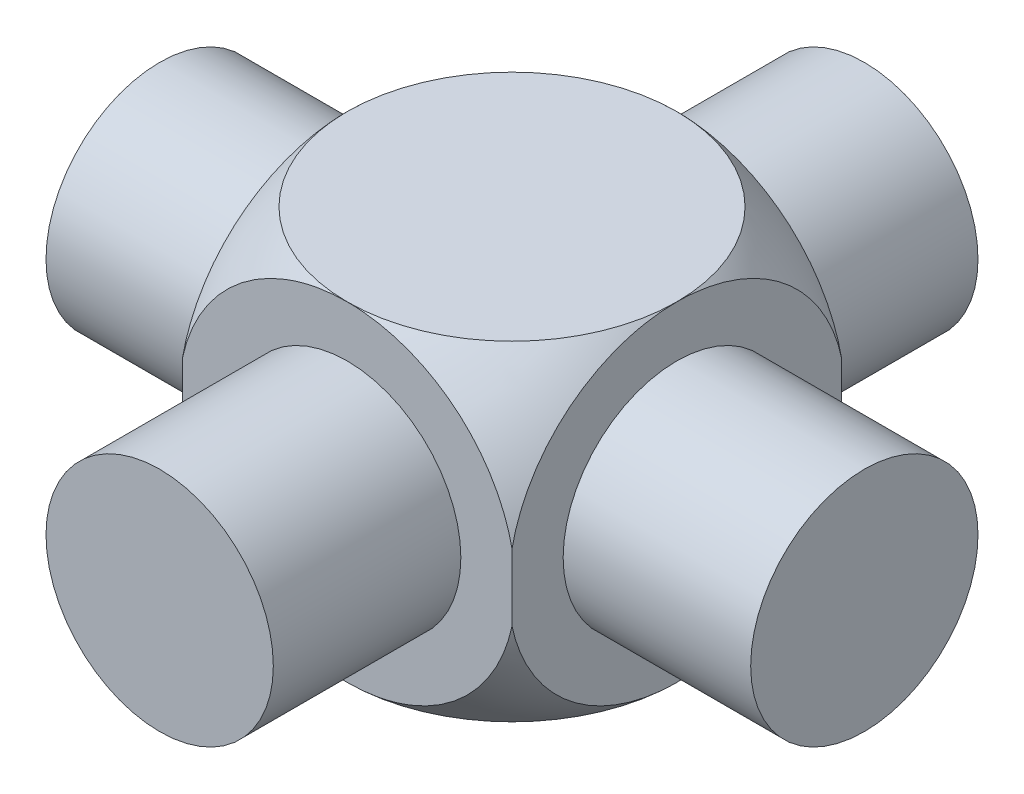
ISO-10303-21;
HEADER;
FILE_DESCRIPTION(('STEP AP214'),'2;1');
FILE_NAME('part.step','',(''),(''),'','','');
FILE_SCHEMA(('AUTOMOTIVE_DESIGN { 1 0 10303 214 1 1 1 1 }'));
ENDSEC;
DATA;
#1=APPLICATION_CONTEXT('core data for automotive mechanical design processes');
#2=APPLICATION_PROTOCOL_DEFINITION('international standard','automotive_design',2000,#1);
#3=PRODUCT_CONTEXT('',#1,'mechanical');
#4=PRODUCT('Part','Part','',(#3));
#5=PRODUCT_RELATED_PRODUCT_CATEGORY('part','',(#4));
#6=PRODUCT_DEFINITION_FORMATION('','',#4);
#7=PRODUCT_DEFINITION_CONTEXT('part definition',#1,'design');
#8=PRODUCT_DEFINITION('design','',#6,#7);
#9=PRODUCT_DEFINITION_SHAPE('','',#8);
#10=(LENGTH_UNIT() NAMED_UNIT(*) SI_UNIT(.MILLI.,.METRE.));
#11=(NAMED_UNIT(*) PLANE_ANGLE_UNIT() SI_UNIT($,.RADIAN.));
#12=(NAMED_UNIT(*) SI_UNIT($,.STERADIAN.) SOLID_ANGLE_UNIT());
#13=UNCERTAINTY_MEASURE_WITH_UNIT(LENGTH_MEASURE(1.E-05),#10,'distance_accuracy_value','');
#14=(GEOMETRIC_REPRESENTATION_CONTEXT(3) GLOBAL_UNCERTAINTY_ASSIGNED_CONTEXT((#13)) GLOBAL_UNIT_ASSIGNED_CONTEXT((#10,
#11,#12)) REPRESENTATION_CONTEXT('',''));
#15=CARTESIAN_POINT('',(0.,0.,0.));
#16=DIRECTION('',(0.,0.,1.));
#17=DIRECTION('',(1.,0.,0.));
#18=AXIS2_PLACEMENT_3D('',#15,#16,#17);
#19=CARTESIAN_POINT('',(0.,0.,0.));
#20=DIRECTION('',(0.,0.,-1.));
#21=DIRECTION('',(-1.,0.,0.));
#22=AXIS2_PLACEMENT_3D('',#19,#20,#21);
#23=PLANE('',#22);
#24=CARTESIAN_POINT('',(0.,0.,0.));
#25=DIRECTION('',(0.,0.,-1.));
#26=DIRECTION('',(-1.,0.,0.));
#27=AXIS2_PLACEMENT_3D('',#24,#25,#26);
#28=CIRCLE('',#27,5.);
#29=CARTESIAN_POINT('',(-5.,0.,0.));
#30=VERTEX_POINT('',#29);
#31=EDGE_CURVE('E271',#30,#30,#28,.F.);
#32=ORIENTED_EDGE('',*,*,#31,.T.);
#33=EDGE_LOOP('',(#32));
#34=FACE_BOUND('',#33,.T.);
#35=DIRECTION('',(0.,1.,0.));
#36=VECTOR('',#35,1.);
#37=CARTESIAN_POINT('',(7.25,-7.25,0.));
#38=LINE('',#37,#36);
#39=CARTESIAN_POINT('',(7.24999999999937,-1.47556028833769,0.));
#40=VERTEX_POINT('',#39);
#41=CARTESIAN_POINT('',(7.2500000000003,1.47556028833331,0.));
#42=VERTEX_POINT('',#41);
#43=EDGE_CURVE('E192',#40,#42,#38,.T.);
#44=ORIENTED_EDGE('',*,*,#43,.F.);
#45=CARTESIAN_POINT('',(0.,7.25000000076297,-1.77719099726946E-09));
#46=CARTESIAN_POINT('',(0.35472004270874,7.24999758244147,-1.8330662880225E-09));
#47=CARTESIAN_POINT('',(0.709474508952601,7.22523308015603,-4.94346678581421E-10));
#48=CARTESIAN_POINT('',(1.41224711914956,7.12649843602525,4.94667282722035E-10));
#49=CARTESIAN_POINT('',(1.76026074510913,7.05249639271668,1.43866058347404E-10));
#50=CARTESIAN_POINT('',(2.51233008689046,6.83612193131198,-1.73252608140504E-10));
#51=CARTESIAN_POINT('',(2.91331280350856,6.68287158037924,-4.63974928758699E-11));
#52=CARTESIAN_POINT('',(3.68315950732936,6.30982066746921,4.64110559939562E-11));
#53=CARTESIAN_POINT('',(4.05201407117917,6.09000066433889,1.23174432754697E-11));
#54=CARTESIAN_POINT('',(4.73896399465613,5.59465483068441,-1.20692013764072E-11));
#55=CARTESIAN_POINT('',(5.05793252134144,5.32034096251592,-3.23112867431066E-12));
#56=CARTESIAN_POINT('',(5.64389438891725,4.72094491768709,3.23048269411637E-12));
#57=CARTESIAN_POINT('',(5.91089810814616,4.39587290179467,8.562630617821E-13));
#58=CARTESIAN_POINT('',(6.37909598008788,3.71230531610222,-8.36657729446776E-13));
#59=CARTESIAN_POINT('',(6.58165695898144,3.35474544226318,-2.24074556656652E-13));
#60=CARTESIAN_POINT('',(6.92294318845848,2.61035305836525,2.24059101391433E-13));
#61=CARTESIAN_POINT('',(7.06167284106879,2.22352256905132,0.));
#62=CARTESIAN_POINT('',(7.26963430995826,1.43712161220858,0.));
#63=CARTESIAN_POINT('',(7.33976410707118,1.03778838306784,0.));
#64=CARTESIAN_POINT('',(7.41160906915009,0.233019121038544,0.));
#65=CARTESIAN_POINT('',(7.41332699506261,-0.172416664904157,0.));
#66=CARTESIAN_POINT('',(7.34846706762037,-0.975703822197179,0.));
#67=CARTESIAN_POINT('',(7.28223584873591,-1.37358324614371,0.));
#68=CARTESIAN_POINT('',(7.08398733439277,-2.15258969912997,0.));
#69=CARTESIAN_POINT('',(6.95197061862117,-2.53371687575455,0.));
#70=CARTESIAN_POINT('',(6.62588148450303,-3.26895967896404,0.));
#71=CARTESIAN_POINT('',(6.43173515974464,-3.62304251035949,0.));
#72=CARTESIAN_POINT('',(5.98718559477087,-4.29390583691687,0.));
#73=CARTESIAN_POINT('',(5.73678137269134,-4.61068568088594,0.));
#74=CARTESIAN_POINT('',(5.18488673761718,-5.20074887357059,0.));
#75=CARTESIAN_POINT('',(4.88301213721546,-5.47367270146353,0.));
#76=CARTESIAN_POINT('',(4.2383736787491,-5.96592873388828,0.));
#77=CARTESIAN_POINT('',(3.89560734515286,-6.18525769140469,0.));
#78=CARTESIAN_POINT('',(3.17295154351401,-6.56820396583086,0.));
#79=CARTESIAN_POINT('',(2.79254013382352,-6.73083566338456,0.));
#80=CARTESIAN_POINT('',(2.0102258224592,-6.99165660760054,0.));
#81=CARTESIAN_POINT('',(1.6083192129857,-7.08983469735805,0.));
#82=CARTESIAN_POINT('',(0.783923633691014,-7.22140216196393,0.));
#83=CARTESIAN_POINT('',(0.36117164060091,-7.25314529107947,0.));
#84=CARTESIAN_POINT('',(-0.483796894375683,-7.24636211173279,0.));
#85=CARTESIAN_POINT('',(-0.906013375771644,-7.20782846885773,0.));
#86=CARTESIAN_POINT('',(-1.74430302543486,-7.06011433150494,0.));
#87=CARTESIAN_POINT('',(-2.16019743431917,-6.94991412113624,0.));
#88=CARTESIAN_POINT('',(-2.96713587965513,-6.66023886281381,0.));
#89=CARTESIAN_POINT('',(-3.35818228140884,-6.48077042009926,0.));
#90=CARTESIAN_POINT('',(-4.09808265267317,-6.0600096399267,0.));
#91=CARTESIAN_POINT('',(-4.44746108450747,-5.81964040748842,0.));
#92=CARTESIAN_POINT('',(-5.09957014268305,-5.28227019095751,0.));
#93=CARTESIAN_POINT('',(-5.40230625075857,-4.98527587103773,0.));
#94=CARTESIAN_POINT('',(-5.94473662797111,-4.35107479407495,0.));
#95=CARTESIAN_POINT('',(-6.18579954264804,-4.01503815391247,0.));
#96=CARTESIAN_POINT('',(-6.6069775710532,-3.30672272860827,0.));
#97=CARTESIAN_POINT('',(-6.78709861377826,-2.93444747363937,0.));
#98=CARTESIAN_POINT('',(-7.07839674371209,-2.17083311778016,0.));
#99=CARTESIAN_POINT('',(-7.19065384843362,-1.77990569125445,0.));
#100=CARTESIAN_POINT('',(-7.34740434102663,-0.984696410124609,0.));
#101=CARTESIAN_POINT('',(-7.39190119322148,-0.580415239326306,0.));
#102=CARTESIAN_POINT('',(-7.41171466936599,0.226862005811839,0.));
#103=CARTESIAN_POINT('',(-7.38753567781182,0.629845799708528,0.));
#104=CARTESIAN_POINT('',(-7.27180885183131,1.42601383896196,0.));
#105=CARTESIAN_POINT('',(-7.18026201467173,1.81919822929319,0.));
#106=CARTESIAN_POINT('',(-6.93261807963404,2.58437814134862,0.));
#107=CARTESIAN_POINT('',(-6.77656450030367,2.95638775619996,2.28344748060027E-13));
#108=CARTESIAN_POINT('',(-6.40455019211355,3.66911024252852,-2.28342080259962E-13));
#109=CARTESIAN_POINT('',(-6.18859016318324,4.00982347960157,-8.52159373664784E-13));
#110=CARTESIAN_POINT('',(-5.70177028009148,4.65243154888102,8.56879087574978E-13));
#111=CARTESIAN_POINT('',(-5.43061298601764,4.95410093251914,3.20612961309701E-12));
#112=CARTESIAN_POINT('',(-4.84207145068746,5.50839460038712,-3.20664066663652E-12));
#113=CARTESIAN_POINT('',(-4.52467984779606,5.76101105921717,-1.19704326560291E-11));
#114=CARTESIAN_POINT('',(-3.84817782947764,6.2139166521009,1.21361601462096E-11));
#115=CARTESIAN_POINT('',(-3.48855066465639,6.4134329074137,4.55846389746751E-11));
#116=CARTESIAN_POINT('',(-2.7415685623936,6.75069428408171,-4.55660564907867E-11));
#117=CARTESIAN_POINT('',(-2.35422498788297,6.88846455315707,-1.70100808543847E-10));
#118=CARTESIAN_POINT('',(-1.63934466823354,7.07900629924726,1.37147771060555E-10));
#119=CARTESIAN_POINT('',(-1.31475874468002,7.14307378309944,4.6583132179025E-10));
#120=CARTESIAN_POINT('',(-0.660123700746068,7.22856347286935,-4.65650190267199E-10));
#121=CARTESIAN_POINT('',(-0.330076753722838,7.25000225107762,-1.72519750278224E-09));
#122=CARTESIAN_POINT('',(0.,7.25000000076297,-1.77719099726946E-09));
#123=B_SPLINE_CURVE_WITH_KNOTS('',3,(#45,#46,#47,#48,#49,#50,#51,#52,#53,#54,#55,#56,#57,#58,
#59,#60,#61,#62,#63,#64,#65,#66,#67,#68,#69,#70,#71,#72,#73,#74,#75,#76,#77,#78,#79,#80,#81,#82,
#83,#84,#85,#86,#87,#88,#89,#90,#91,#92,#93,#94,#95,#96,#97,#98,#99,#100,#101,#102,#103,#104,
#105,#106,#107,#108,#109,#110,#111,#112,#113,#114,#115,#116,#117,#118,#119,#120,#121,#122),
.UNSPECIFIED.,.T.,.F.,(4,2,2,2,2,2,2,2,2,2,2,2,2,2,2,2,2,2,2,2,2,2,2,2,2,2,2,2,2,2,2,2,2,2,2,2,
2,2,4),(0.,1.06333320912271,2.12735603352841,3.40871962662946,4.69045779354146,5.94636421034597,
7.20201954130626,8.42892489908558,9.65574563258377,10.86628321429,12.0767719414208,
13.2811160618595,14.4854495700748,15.6912210546593,16.8970135851029,18.112235571963,
19.3275311641273,20.5630077594007,21.7986981590405,23.0646628104722,24.3307595914606,
25.6152773862206,26.8996727229414,28.1656566338067,29.4314916436459,30.666160289686,
31.9007087810176,33.115054111898,34.3293373558469,35.5347254996096,36.7400958000027,
37.944654238371,39.1491986036233,40.3604143791444,41.5718232211299,42.8000036997583,
44.0276835131523,45.0175291901034,46.0069899804008),.UNSPECIFIED.);
#124=CARTESIAN_POINT('',(0.,-7.25,0.));
#125=VERTEX_POINT('',#124);
#126=EDGE_CURVE('E118',#40,#125,#123,.T.);
#127=ORIENTED_EDGE('',*,*,#126,.T.);
#128=CARTESIAN_POINT('',(-7.25,-1.47556028833474,0.));
#129=VERTEX_POINT('',#128);
#130=EDGE_CURVE('E203',#125,#129,#123,.T.);
#131=ORIENTED_EDGE('',*,*,#130,.T.);
#132=DIRECTION('',(0.,-1.,0.));
#133=VECTOR('',#132,1.);
#134=CARTESIAN_POINT('',(-7.25,-7.25,0.));
#135=LINE('',#134,#133);
#136=CARTESIAN_POINT('',(-7.25000000000223,1.47556028832412,0.));
#137=VERTEX_POINT('',#136);
#138=EDGE_CURVE('E189',#137,#129,#135,.T.);
#139=ORIENTED_EDGE('',*,*,#138,.F.);
#140=CARTESIAN_POINT('',(0.,7.25,0.));
#141=VERTEX_POINT('',#140);
#142=EDGE_CURVE('E174',#137,#141,#123,.T.);
#143=ORIENTED_EDGE('',*,*,#142,.T.);
#144=EDGE_CURVE('E205',#141,#42,#123,.T.);
#145=ORIENTED_EDGE('',*,*,#144,.T.);
#146=EDGE_LOOP('',(#44,#127,#131,#139,#143,#145));
#147=FACE_BOUND('',#146,.T.);
#148=ADVANCED_FACE('F34',(#34,#147),#23,.T.);
#149=CARTESIAN_POINT('',(0.,0.,14.5));
#150=DIRECTION('',(0.,0.,-1.));
#151=DIRECTION('',(-1.,0.,0.));
#152=AXIS2_PLACEMENT_3D('',#149,#150,#151);
#153=PLANE('',#152);
#154=CARTESIAN_POINT('',(0.,0.,14.5));
#155=DIRECTION('',(0.,0.,-1.));
#156=DIRECTION('',(-1.,0.,0.));
#157=AXIS2_PLACEMENT_3D('',#154,#155,#156);
#158=CIRCLE('',#157,5.);
#159=CARTESIAN_POINT('',(-5.,0.,14.5));
#160=VERTEX_POINT('',#159);
#161=EDGE_CURVE('E11',#160,#160,#158,.F.);
#162=ORIENTED_EDGE('',*,*,#161,.F.);
#163=EDGE_LOOP('',(#162));
#164=FACE_BOUND('',#163,.T.);
#165=CARTESIAN_POINT('',(0.,7.25,14.5));
#166=CARTESIAN_POINT('',(0.354720042699721,7.24999758165452,14.5));
#167=CARTESIAN_POINT('',(0.70947450893446,7.22523307994391,14.5));
#168=CARTESIAN_POINT('',(1.41224711905393,7.1264984362535,14.5));
#169=CARTESIAN_POINT('',(1.76026074494575,7.05249639281451,14.5));
#170=CARTESIAN_POINT('',(2.51233008665205,6.83612193131934,14.5));
#171=CARTESIAN_POINT('',(2.91331280326306,6.68287158046014,14.5));
#172=CARTESIAN_POINT('',(3.68315950710001,6.30982066761842,14.5));
#173=CARTESIAN_POINT('',(4.05201407097072,6.09000066447799,14.5));
#174=CARTESIAN_POINT('',(4.73896399448261,5.5946548308205,14.5));
#175=CARTESIAN_POINT('',(5.05793252118268,5.32034096265985,14.5));
#176=CARTESIAN_POINT('',(5.64389438877702,4.72094491784899,14.5));
#177=CARTESIAN_POINT('',(5.9108981080115,4.39587290196849,14.5));
#178=CARTESIAN_POINT('',(6.37909597996991,3.71230531629671,14.5));
#179=CARTESIAN_POINT('',(6.58165695887391,3.35474544246599,14.5));
#180=CARTESIAN_POINT('',(6.92294318837549,2.61035305857797,14.5));
#181=CARTESIAN_POINT('',(7.06167284099911,2.22352256926527,14.5));
#182=CARTESIAN_POINT('',(7.26963430991401,1.43712161242477,14.5));
#183=CARTESIAN_POINT('',(7.33976410703939,1.03778838328513,14.5));
#184=CARTESIAN_POINT('',(7.41160906914293,0.233019121257405,14.5));
#185=CARTESIAN_POINT('',(7.41332699506787,-0.172416664684815,14.5));
#186=CARTESIAN_POINT('',(7.34846706765035,-0.975703821979273,14.5));
#187=CARTESIAN_POINT('',(7.28223584877814,-1.37358324592771,14.5));
#188=CARTESIAN_POINT('',(7.08398733445889,-2.15258969892019,14.5));
#189=CARTESIAN_POINT('',(6.95197061869888,-2.53371687554907,14.5));
#190=CARTESIAN_POINT('',(6.62588148460311,-3.26895967876865,14.5));
#191=CARTESIAN_POINT('',(6.43173515985557,-3.62304251016992,14.5));
#192=CARTESIAN_POINT('',(5.98718559490238,-4.29390583674057,14.5));
#193=CARTESIAN_POINT('',(5.73678137283259,-4.61068568071709,14.5));
#194=CARTESIAN_POINT('',(5.18488673777673,-5.20074887341798,14.5));
#195=CARTESIAN_POINT('',(4.8830121373836,-5.47367270131974,14.5));
#196=CARTESIAN_POINT('',(4.23837367893278,-5.96592873376341,14.5));
#197=CARTESIAN_POINT('',(3.8956073453435,-6.18525769128991,14.5));
#198=CARTESIAN_POINT('',(3.17295154371721,-6.56820396573716,14.5));
#199=CARTESIAN_POINT('',(2.79254013403233,-6.73083566330195,14.5));
#200=CARTESIAN_POINT('',(2.01022582267734,-6.99165660754082,14.5));
#201=CARTESIAN_POINT('',(1.60831921320756,-7.08983469731014,14.5));
#202=CARTESIAN_POINT('',(0.783923633918534,-7.22140216194041,14.5));
#203=CARTESIAN_POINT('',(0.36117164083032,-7.25314529106856,14.5));
#204=CARTESIAN_POINT('',(-0.483796894144614,-7.24636211174739,14.5));
#205=CARTESIAN_POINT('',(-0.906013375540807,-7.20782846888524,14.5));
#206=CARTESIAN_POINT('',(-1.74430302520763,-7.06011433155833,14.5));
#207=CARTESIAN_POINT('',(-2.16019743409531,-6.94991412120246,14.5));
#208=CARTESIAN_POINT('',(-2.96713587944026,-6.66023886290508,14.5));
#209=CARTESIAN_POINT('',(-3.35818228119956,-6.48077042020276,14.5));
#210=CARTESIAN_POINT('',(-4.09808265247796,-6.06000964005301,14.5));
#211=CARTESIAN_POINT('',(-4.44746108432062,-5.81964040762517,14.5));
#212=CARTESIAN_POINT('',(-5.09957014251458,-5.28227019111355,14.5));
#213=CARTESIAN_POINT('',(-5.40230625060011,-4.98527587120262,14.5));
#214=CARTESIAN_POINT('',(-5.94473662783364,-4.35107479425555,14.5));
#215=CARTESIAN_POINT('',(-6.18579954252155,-4.01503815409999,14.5));
#216=CARTESIAN_POINT('',(-6.60697757094969,-3.30672272880754,14.5));
#217=CARTESIAN_POINT('',(-6.78709861368673,-2.93444747384346,14.5));
#218=CARTESIAN_POINT('',(-7.07839674364479,-2.17083311799187,14.5));
#219=CARTESIAN_POINT('',(-7.19065384837859,-1.77990569146901,14.5));
#220=CARTESIAN_POINT('',(-7.34740434099628,-0.984696410343177,14.5));
#221=CARTESIAN_POINT('',(-7.39190119320361,-0.580415239546038,14.5));
#222=CARTESIAN_POINT('',(-7.41171466937296,0.22686200559107,14.5));
#223=CARTESIAN_POINT('',(-7.38753567783128,0.629845799487868,14.5));
#224=CARTESIAN_POINT('',(-7.27180885187543,1.42601383874515,14.5));
#225=CARTESIAN_POINT('',(-7.18026201472776,1.81919822908008,14.5));
#226=CARTESIAN_POINT('',(-6.93261807971244,2.58437814114632,14.5));
#227=CARTESIAN_POINT('',(-6.7765645003923,2.95638775600468,14.5));
#228=CARTESIAN_POINT('',(-6.40455019222323,3.66911024234386,14.5));
#229=CARTESIAN_POINT('',(-6.18859016330451,4.00982347942089,14.5));
#230=CARTESIAN_POINT('',(-5.70177028023827,4.65243154870796,14.5));
#231=CARTESIAN_POINT('',(-5.43061298617899,4.95410093235022,14.5));
#232=CARTESIAN_POINT('',(-4.84207145086755,5.50839460023447,14.5));
#233=CARTESIAN_POINT('',(-4.52467984797876,5.76101105907498,14.5));
#234=CARTESIAN_POINT('',(-3.84817782965755,6.21391665200061,14.5));
#235=CARTESIAN_POINT('',(-3.48855066483026,6.41343290734414,14.5));
#236=CARTESIAN_POINT('',(-2.74156856257539,6.75069428399069,14.5));
#237=CARTESIAN_POINT('',(-2.35422498808067,6.88846455301815,14.5));
#238=CARTESIAN_POINT('',(-1.63934466844182,7.07900629926128,14.5));
#239=CARTESIAN_POINT('',(-1.31475874488051,7.14307378326579,14.5));
#240=CARTESIAN_POINT('',(-0.660123700874817,7.22856347266006,14.5));
#241=CARTESIAN_POINT('',(-0.330076753787175,7.25000225033697,14.5));
#242=CARTESIAN_POINT('',(0.,7.25,14.5));
#243=B_SPLINE_CURVE_WITH_KNOTS('',3,(#165,#166,#167,#168,#169,#170,#171,#172,#173,#174,#175,
#176,#177,#178,#179,#180,#181,#182,#183,#184,#185,#186,#187,#188,#189,#190,#191,#192,#193,#194,
#195,#196,#197,#198,#199,#200,#201,#202,#203,#204,#205,#206,#207,#208,#209,#210,#211,#212,#213,
#214,#215,#216,#217,#218,#219,#220,#221,#222,#223,#224,#225,#226,#227,#228,#229,#230,#231,#232,
#233,#234,#235,#236,#237,#238,#239,#240,#241,#242),.UNSPECIFIED.,.T.,.F.,(4,2,2,2,2,2,2,2,2,2,2,
2,2,2,2,2,2,2,2,2,2,2,2,2,2,2,2,2,2,2,2,2,2,2,2,2,2,2,4),(0.,1.06333320902845,2.12735603324236,
3.4087196262976,4.69045779325729,5.94636421008676,7.20201954102809,8.42892489880191,
9.65574563230973,10.8662832140191,12.0767719411487,13.281116061587,14.4854495698031,
15.6912210543873,16.8970135848302,18.112235571689,19.3275311638521,20.5630077591231,
21.7986981587604,23.0646628101893,24.330759591175,25.6152773859349,26.8996727226557,
28.1656566335239,29.4314916433659,30.6661602894083,31.9007087807425,33.1150541116248,
34.3293373555744,35.5347254993351,36.740095799731,37.9446542381065,39.1491986033511,
40.3604143788504,41.5718232208557,42.8000036995246,44.0276835128739,45.0175291898705,
46.0069899802982),.UNSPECIFIED.);
#244=CARTESIAN_POINT('',(7.25,-1.4755602883333,14.5000000000003));
#245=VERTEX_POINT('',#244);
#246=CARTESIAN_POINT('',(0.,-7.25,14.5));
#247=VERTEX_POINT('',#246);
#248=EDGE_CURVE('E106',#245,#247,#243,.T.);
#249=ORIENTED_EDGE('',*,*,#248,.F.);
#250=DIRECTION('',(0.,1.,0.));
#251=VECTOR('',#250,1.);
#252=CARTESIAN_POINT('',(7.25,-7.25,14.5));
#253=LINE('',#252,#251);
#254=CARTESIAN_POINT('',(7.25,1.47556028833769,14.4999999999994));
#255=VERTEX_POINT('',#254);
#256=EDGE_CURVE('E128',#245,#255,#253,.T.);
#257=ORIENTED_EDGE('',*,*,#256,.T.);
#258=CARTESIAN_POINT('',(0.,7.25,14.5));
#259=VERTEX_POINT('',#258);
#260=EDGE_CURVE('E186',#259,#255,#243,.T.);
#261=ORIENTED_EDGE('',*,*,#260,.F.);
#262=CARTESIAN_POINT('',(-7.25,1.4755602883333,14.5000000000003));
#263=VERTEX_POINT('',#262);
#264=EDGE_CURVE('E180',#263,#259,#243,.T.);
#265=ORIENTED_EDGE('',*,*,#264,.F.);
#266=DIRECTION('',(0.,-1.,0.));
#267=VECTOR('',#266,1.);
#268=CARTESIAN_POINT('',(-7.25,-7.25,14.5));
#269=LINE('',#268,#267);
#270=CARTESIAN_POINT('',(-7.25,-1.47556028833768,14.4999999999994));
#271=VERTEX_POINT('',#270);
#272=EDGE_CURVE('E188',#263,#271,#269,.T.);
#273=ORIENTED_EDGE('',*,*,#272,.T.);
#274=EDGE_CURVE('E129',#247,#271,#243,.T.);
#275=ORIENTED_EDGE('',*,*,#274,.F.);
#276=EDGE_LOOP('',(#249,#257,#261,#265,#273,#275));
#277=FACE_BOUND('',#276,.T.);
#278=ADVANCED_FACE('F168',(#164,#277),#153,.F.);
#279=CARTESIAN_POINT('',(-7.25,-7.25,14.5));
#280=DIRECTION('',(1.,0.,0.));
#281=DIRECTION('',(0.,0.,-1.));
#282=AXIS2_PLACEMENT_3D('',#279,#280,#281);
#283=PLANE('',#282);
#284=CARTESIAN_POINT('',(-7.25,0.,7.25));
#285=DIRECTION('',(1.,0.,0.));
#286=DIRECTION('',(0.,0.,-1.));
#287=AXIS2_PLACEMENT_3D('',#284,#285,#286);
#288=CIRCLE('',#287,5.);
#289=CARTESIAN_POINT('',(-7.25,0.,2.25));
#290=VERTEX_POINT('',#289);
#291=EDGE_CURVE('E43',#290,#290,#288,.F.);
#292=ORIENTED_EDGE('',*,*,#291,.F.);
#293=EDGE_LOOP('',(#292));
#294=FACE_BOUND('',#293,.T.);
#295=CARTESIAN_POINT('',(-7.25,7.25,7.25));
#296=CARTESIAN_POINT('',(-7.25,7.24999758165452,7.60472004269972));
#297=CARTESIAN_POINT('',(-7.25,7.22523307994391,7.95947450893446));
#298=CARTESIAN_POINT('',(-7.25,7.1264984362535,8.66224711905393));
#299=CARTESIAN_POINT('',(-7.25,7.05249639281451,9.01026074494576));
#300=CARTESIAN_POINT('',(-7.25,6.83612193131934,9.76233008665205));
#301=CARTESIAN_POINT('',(-7.25,6.68287158046014,10.1633128032631));
#302=CARTESIAN_POINT('',(-7.25,6.30982066761842,10.9331595071));
#303=CARTESIAN_POINT('',(-7.25,6.09000066447799,11.3020140709707));
#304=CARTESIAN_POINT('',(-7.25,5.5946548308205,11.9889639944826));
#305=CARTESIAN_POINT('',(-7.25,5.32034096265985,12.3079325211827));
#306=CARTESIAN_POINT('',(-7.25,4.72094491784899,12.893894388777));
#307=CARTESIAN_POINT('',(-7.25,4.39587290196849,13.1608981080115));
#308=CARTESIAN_POINT('',(-7.25,3.71230531629671,13.6290959799699));
#309=CARTESIAN_POINT('',(-7.25,3.35474544246599,13.8316569588739));
#310=CARTESIAN_POINT('',(-7.25,2.61035305857797,14.1729431883755));
#311=CARTESIAN_POINT('',(-7.25,2.22352256926527,14.3116728409991));
#312=CARTESIAN_POINT('',(-7.25,1.43712161242476,14.519634309914));
#313=CARTESIAN_POINT('',(-7.25,1.03778838328513,14.5897641070394));
#314=CARTESIAN_POINT('',(-7.25,0.233019121257401,14.6616090691429));
#315=CARTESIAN_POINT('',(-7.25,-0.172416664684819,14.6633269950679));
#316=CARTESIAN_POINT('',(-7.25,-0.975703821979276,14.5984670676503));
#317=CARTESIAN_POINT('',(-7.25,-1.37358324592771,14.5322358487781));
#318=CARTESIAN_POINT('',(-7.25,-2.15258969892019,14.3339873344589));
#319=CARTESIAN_POINT('',(-7.25,-2.53371687554908,14.2019706186989));
#320=CARTESIAN_POINT('',(-7.25,-3.26895967876866,13.8758814846031));
#321=CARTESIAN_POINT('',(-7.25,-3.62304251016993,13.6817351598556));
#322=CARTESIAN_POINT('',(-7.25,-4.29390583674057,13.2371855949024));
#323=CARTESIAN_POINT('',(-7.25,-4.61068568071709,12.9867813728326));
#324=CARTESIAN_POINT('',(-7.25,-5.20074887341798,12.4348867377767));
#325=CARTESIAN_POINT('',(-7.25,-5.47367270131975,12.1330121373836));
#326=CARTESIAN_POINT('',(-7.25,-5.96592873376341,11.4883736789328));
#327=CARTESIAN_POINT('',(-7.25,-6.18525769128991,11.1456073453435));
#328=CARTESIAN_POINT('',(-7.25,-6.56820396573717,10.4229515437172));
#329=CARTESIAN_POINT('',(-7.25,-6.73083566330195,10.0425401340323));
#330=CARTESIAN_POINT('',(-7.25,-6.99165660754082,9.26022582267733));
#331=CARTESIAN_POINT('',(-7.25,-7.08983469731015,8.85831921320756));
#332=CARTESIAN_POINT('',(-7.25,-7.22140216194042,8.03392363391853));
#333=CARTESIAN_POINT('',(-7.25,-7.25314529106856,7.61117164083032));
#334=CARTESIAN_POINT('',(-7.25,-7.24636211174739,6.76620310585538));
#335=CARTESIAN_POINT('',(-7.25,-7.20782846888524,6.34398662445919));
#336=CARTESIAN_POINT('',(-7.25,-7.06011433155833,5.50569697479236));
#337=CARTESIAN_POINT('',(-7.25,-6.94991412120246,5.08980256590468));
#338=CARTESIAN_POINT('',(-7.25,-6.66023886290508,4.28286412055974));
#339=CARTESIAN_POINT('',(-7.25,-6.48077042020276,3.89181771880044));
#340=CARTESIAN_POINT('',(-7.25,-6.06000964005301,3.15191734752204));
#341=CARTESIAN_POINT('',(-7.25,-5.81964040762517,2.80253891567937));
#342=CARTESIAN_POINT('',(-7.25,-5.28227019111355,2.15042985748542));
#343=CARTESIAN_POINT('',(-7.25,-4.98527587120262,1.84769374939989));
#344=CARTESIAN_POINT('',(-7.25,-4.35107479425555,1.30526337216635));
#345=CARTESIAN_POINT('',(-7.25,-4.01503815409999,1.06420045747844));
#346=CARTESIAN_POINT('',(-7.25,-3.30672272880754,0.643022429050305));
#347=CARTESIAN_POINT('',(-7.25,-2.93444747384345,0.462901386313267));
#348=CARTESIAN_POINT('',(-7.25,-2.17083311799187,0.171603256355211));
#349=CARTESIAN_POINT('',(-7.25,-1.77990569146901,0.0593461516214092));
#350=CARTESIAN_POINT('',(-7.25,-0.984696410343174,-0.0974043409962848));
#351=CARTESIAN_POINT('',(-7.25,-0.580415239546035,-0.141901193203611));
#352=CARTESIAN_POINT('',(-7.25,0.226862005591074,-0.161714669372959));
#353=CARTESIAN_POINT('',(-7.25,0.629845799487873,-0.137535677831282));
#354=CARTESIAN_POINT('',(-7.25,1.42601383874516,-0.0218088518754313));
#355=CARTESIAN_POINT('',(-7.25,1.81919822908009,0.0697379852722339));
#356=CARTESIAN_POINT('',(-7.25,2.58437814114632,0.317381920287554));
#357=CARTESIAN_POINT('',(-7.25,2.95638775600469,0.473435499607704));
#358=CARTESIAN_POINT('',(-7.25,3.66911024234387,0.845449807776769));
#359=CARTESIAN_POINT('',(-7.25,4.00982347942089,1.06140983669549));
#360=CARTESIAN_POINT('',(-7.25,4.65243154870796,1.54822971976173));
#361=CARTESIAN_POINT('',(-7.25,4.95410093235022,1.81938701382101));
#362=CARTESIAN_POINT('',(-7.25,5.50839460023447,2.40792854913245));
#363=CARTESIAN_POINT('',(-7.25,5.76101105907498,2.72532015202124));
#364=CARTESIAN_POINT('',(-7.25,6.21391665200061,3.40182217034245));
#365=CARTESIAN_POINT('',(-7.25,6.41343290734414,3.76144933516974));
#366=CARTESIAN_POINT('',(-7.25,6.75069428399069,4.50843143742461));
#367=CARTESIAN_POINT('',(-7.25,6.88846455301816,4.89577501191933));
#368=CARTESIAN_POINT('',(-7.25,7.07900629926128,5.61065533155818));
#369=CARTESIAN_POINT('',(-7.25,7.1430737832658,5.93524125511949));
#370=CARTESIAN_POINT('',(-7.25,7.22856347266007,6.58987629912518));
#371=CARTESIAN_POINT('',(-7.25,7.25000225033697,6.91992324621283));
#372=CARTESIAN_POINT('',(-7.25,7.25,7.25));
#373=B_SPLINE_CURVE_WITH_KNOTS('',3,(#295,#296,#297,#298,#299,#300,#301,#302,#303,#304,#305,
#306,#307,#308,#309,#310,#311,#312,#313,#314,#315,#316,#317,#318,#319,#320,#321,#322,#323,#324,
#325,#326,#327,#328,#329,#330,#331,#332,#333,#334,#335,#336,#337,#338,#339,#340,#341,#342,#343,
#344,#345,#346,#347,#348,#349,#350,#351,#352,#353,#354,#355,#356,#357,#358,#359,#360,#361,#362,
#363,#364,#365,#366,#367,#368,#369,#370,#371,#372),.UNSPECIFIED.,.T.,.F.,(4,2,2,2,2,2,2,2,2,2,2,
2,2,2,2,2,2,2,2,2,2,2,2,2,2,2,2,2,2,2,2,2,2,2,2,2,2,2,4),(0.,1.06333320902844,2.12735603324236,
3.4087196262976,4.69045779325729,5.94636421008676,7.20201954102808,8.42892489880191,
9.65574563230973,10.8662832140191,12.0767719411487,13.281116061587,14.4854495698031,
15.6912210543873,16.8970135848302,18.1122355716891,19.3275311638521,20.5630077591231,
21.7986981587604,23.0646628101893,24.330759591175,25.6152773859349,26.8996727226557,
28.1656566335239,29.4314916433659,30.6661602894083,31.9007087807425,33.1150541116248,
34.3293373555744,35.5347254993351,36.740095799731,37.9446542381065,39.1491986033511,
40.3604143788504,41.5718232208557,42.8000036995246,44.0276835128739,45.0175291898705,
46.0069899802982),.UNSPECIFIED.);
#374=CARTESIAN_POINT('',(-7.25,-7.25,7.25));
#375=VERTEX_POINT('',#374);
#376=EDGE_CURVE('E122',#271,#375,#373,.T.);
#377=ORIENTED_EDGE('',*,*,#376,.F.);
#378=ORIENTED_EDGE('',*,*,#272,.F.);
#379=CARTESIAN_POINT('',(-7.25,7.25,7.25));
#380=VERTEX_POINT('',#379);
#381=EDGE_CURVE('E151',#380,#263,#373,.T.);
#382=ORIENTED_EDGE('',*,*,#381,.F.);
#383=EDGE_CURVE('E143',#137,#380,#373,.T.);
#384=ORIENTED_EDGE('',*,*,#383,.F.);
#385=ORIENTED_EDGE('',*,*,#138,.T.);
#386=EDGE_CURVE('E198',#375,#129,#373,.T.);
#387=ORIENTED_EDGE('',*,*,#386,.F.);
#388=EDGE_LOOP('',(#377,#378,#382,#384,#385,#387));
#389=FACE_BOUND('',#388,.T.);
#390=ADVANCED_FACE('F156',(#294,#389),#283,.F.);
#391=CARTESIAN_POINT('',(7.25,-7.25,14.5));
#392=DIRECTION('',(-1.,0.,0.));
#393=DIRECTION('',(0.,0.,1.));
#394=AXIS2_PLACEMENT_3D('',#391,#392,#393);
#395=PLANE('',#394);
#396=CARTESIAN_POINT('',(7.25,0.,7.25));
#397=DIRECTION('',(-1.,0.,0.));
#398=DIRECTION('',(0.,0.,1.));
#399=AXIS2_PLACEMENT_3D('',#396,#397,#398);
#400=CIRCLE('',#399,5.);
#401=CARTESIAN_POINT('',(7.25,0.,12.25));
#402=VERTEX_POINT('',#401);
#403=EDGE_CURVE('E206',#402,#402,#400,.F.);
#404=ORIENTED_EDGE('',*,*,#403,.F.);
#405=EDGE_LOOP('',(#404));
#406=FACE_BOUND('',#405,.T.);
#407=CARTESIAN_POINT('',(7.25,-7.25,7.25));
#408=CARTESIAN_POINT('',(7.25,-7.24999758165452,7.60472004269972));
#409=CARTESIAN_POINT('',(7.25,-7.22523307994391,7.95947450893446));
#410=CARTESIAN_POINT('',(7.25,-7.1264984362535,8.66224711905393));
#411=CARTESIAN_POINT('',(7.25,-7.05249639281451,9.01026074494575));
#412=CARTESIAN_POINT('',(7.25,-6.83612193131934,9.76233008665205));
#413=CARTESIAN_POINT('',(7.25,-6.68287158046014,10.1633128032631));
#414=CARTESIAN_POINT('',(7.25,-6.30982066761842,10.9331595071));
#415=CARTESIAN_POINT('',(7.25,-6.090000664478,11.3020140709707));
#416=CARTESIAN_POINT('',(7.25,-5.5946548308205,11.9889639944826));
#417=CARTESIAN_POINT('',(7.25,-5.32034096265985,12.3079325211827));
#418=CARTESIAN_POINT('',(7.25,-4.72094491784899,12.893894388777));
#419=CARTESIAN_POINT('',(7.25,-4.39587290196849,13.1608981080115));
#420=CARTESIAN_POINT('',(7.25,-3.71230531629671,13.6290959799699));
#421=CARTESIAN_POINT('',(7.25,-3.35474544246599,13.8316569588739));
#422=CARTESIAN_POINT('',(7.25,-2.61035305857797,14.1729431883755));
#423=CARTESIAN_POINT('',(7.25,-2.22352256926527,14.3116728409991));
#424=CARTESIAN_POINT('',(7.25,-1.43712161242476,14.519634309914));
#425=CARTESIAN_POINT('',(7.25,-1.03778838328513,14.5897641070394));
#426=CARTESIAN_POINT('',(7.25,-0.233019121257403,14.6616090691429));
#427=CARTESIAN_POINT('',(7.25,0.172416664684816,14.6633269950679));
#428=CARTESIAN_POINT('',(7.25,0.975703821979274,14.5984670676503));
#429=CARTESIAN_POINT('',(7.25,1.37358324592771,14.5322358487781));
#430=CARTESIAN_POINT('',(7.25,2.15258969892019,14.3339873344589));
#431=CARTESIAN_POINT('',(7.25,2.53371687554907,14.2019706186989));
#432=CARTESIAN_POINT('',(7.25,3.26895967876865,13.8758814846031));
#433=CARTESIAN_POINT('',(7.25,3.62304251016993,13.6817351598556));
#434=CARTESIAN_POINT('',(7.25,4.29390583674057,13.2371855949024));
#435=CARTESIAN_POINT('',(7.25,4.61068568071709,12.9867813728326));
#436=CARTESIAN_POINT('',(7.25,5.20074887341798,12.4348867377767));
#437=CARTESIAN_POINT('',(7.25,5.47367270131975,12.1330121373836));
#438=CARTESIAN_POINT('',(7.25,5.96592873376341,11.4883736789328));
#439=CARTESIAN_POINT('',(7.25,6.18525769128991,11.1456073453435));
#440=CARTESIAN_POINT('',(7.25,6.56820396573717,10.4229515437172));
#441=CARTESIAN_POINT('',(7.25,6.73083566330195,10.0425401340323));
#442=CARTESIAN_POINT('',(7.25,6.99165660754082,9.26022582267734));
#443=CARTESIAN_POINT('',(7.25,7.08983469731015,8.85831921320756));
#444=CARTESIAN_POINT('',(7.25,7.22140216194042,8.03392363391853));
#445=CARTESIAN_POINT('',(7.25,7.25314529106856,7.61117164083032));
#446=CARTESIAN_POINT('',(7.25,7.24636211174739,6.76620310585539));
#447=CARTESIAN_POINT('',(7.25,7.20782846888525,6.34398662445919));
#448=CARTESIAN_POINT('',(7.25,7.06011433155833,5.50569697479237));
#449=CARTESIAN_POINT('',(7.25,6.94991412120246,5.08980256590469));
#450=CARTESIAN_POINT('',(7.25,6.66023886290508,4.28286412055974));
#451=CARTESIAN_POINT('',(7.25,6.48077042020276,3.89181771880044));
#452=CARTESIAN_POINT('',(7.25,6.06000964005301,3.15191734752204));
#453=CARTESIAN_POINT('',(7.25,5.81964040762517,2.80253891567938));
#454=CARTESIAN_POINT('',(7.25,5.28227019111356,2.15042985748542));
#455=CARTESIAN_POINT('',(7.25,4.98527587120262,1.84769374939989));
#456=CARTESIAN_POINT('',(7.25,4.35107479425555,1.30526337216636));
#457=CARTESIAN_POINT('',(7.25,4.01503815409999,1.06420045747845));
#458=CARTESIAN_POINT('',(7.25,3.30672272880754,0.643022429050308));
#459=CARTESIAN_POINT('',(7.25,2.93444747384346,0.46290138631327));
#460=CARTESIAN_POINT('',(7.25,2.17083311799187,0.171603256355214));
#461=CARTESIAN_POINT('',(7.25,1.77990569146902,0.0593461516214109));
#462=CARTESIAN_POINT('',(7.25,0.984696410343181,-0.0974043409962842));
#463=CARTESIAN_POINT('',(7.25,0.580415239546042,-0.14190119320361));
#464=CARTESIAN_POINT('',(7.25,-0.226862005591067,-0.16171466937296));
#465=CARTESIAN_POINT('',(7.25,-0.629845799487865,-0.137535677831282));
#466=CARTESIAN_POINT('',(7.25,-1.42601383874515,-0.0218088518754305));
#467=CARTESIAN_POINT('',(7.25,-1.81919822908008,0.0697379852722353));
#468=CARTESIAN_POINT('',(7.25,-2.58437814114631,0.317381920287554));
#469=CARTESIAN_POINT('',(7.25,-2.95638775600468,0.473435499607702));
#470=CARTESIAN_POINT('',(7.25,-3.66911024234386,0.845449807776765));
#471=CARTESIAN_POINT('',(7.25,-4.00982347942089,1.06140983669549));
#472=CARTESIAN_POINT('',(7.25,-4.65243154870796,1.54822971976173));
#473=CARTESIAN_POINT('',(7.25,-4.95410093235022,1.81938701382101));
#474=CARTESIAN_POINT('',(7.25,-5.50839460023447,2.40792854913245));
#475=CARTESIAN_POINT('',(7.25,-5.76101105907498,2.72532015202124));
#476=CARTESIAN_POINT('',(7.25,-6.21391665200061,3.40182217034244));
#477=CARTESIAN_POINT('',(7.25,-6.41343290734414,3.76144933516973));
#478=CARTESIAN_POINT('',(7.25,-6.75069428399069,4.50843143742461));
#479=CARTESIAN_POINT('',(7.25,-6.88846455301815,4.89577501191933));
#480=CARTESIAN_POINT('',(7.25,-7.07900629926128,5.61065533155817));
#481=CARTESIAN_POINT('',(7.25,-7.14307378326579,5.93524125511949));
#482=CARTESIAN_POINT('',(7.25,-7.22856347266006,6.58987629912518));
#483=CARTESIAN_POINT('',(7.25,-7.25000225033697,6.91992324621282));
#484=CARTESIAN_POINT('',(7.25,-7.25,7.25));
#485=B_SPLINE_CURVE_WITH_KNOTS('',3,(#407,#408,#409,#410,#411,#412,#413,#414,#415,#416,#417,
#418,#419,#420,#421,#422,#423,#424,#425,#426,#427,#428,#429,#430,#431,#432,#433,#434,#435,#436,
#437,#438,#439,#440,#441,#442,#443,#444,#445,#446,#447,#448,#449,#450,#451,#452,#453,#454,#455,
#456,#457,#458,#459,#460,#461,#462,#463,#464,#465,#466,#467,#468,#469,#470,#471,#472,#473,#474,
#475,#476,#477,#478,#479,#480,#481,#482,#483,#484),.UNSPECIFIED.,.T.,.F.,(4,2,2,2,2,2,2,2,2,2,2,
2,2,2,2,2,2,2,2,2,2,2,2,2,2,2,2,2,2,2,2,2,2,2,2,2,2,2,4),(0.,1.06333320902845,2.12735603324236,
3.40871962629759,4.69045779325729,5.94636421008676,7.20201954102808,8.42892489880191,
9.65574563230973,10.8662832140191,12.0767719411487,13.281116061587,14.4854495698031,
15.6912210543873,16.8970135848302,18.1122355716891,19.3275311638521,20.5630077591231,
21.7986981587604,23.0646628101893,24.330759591175,25.6152773859349,26.8996727226557,
28.1656566335239,29.4314916433659,30.6661602894084,31.9007087807425,33.1150541116248,
34.3293373555744,35.5347254993351,36.7400957997311,37.9446542381066,39.1491986033511,
40.3604143788504,41.5718232208557,42.8000036995246,44.0276835128739,45.0175291898705,
46.0069899802982),.UNSPECIFIED.);
#486=CARTESIAN_POINT('',(7.25,7.25,7.25));
#487=VERTEX_POINT('',#486);
#488=EDGE_CURVE('E124',#255,#487,#485,.T.);
#489=ORIENTED_EDGE('',*,*,#488,.F.);
#490=ORIENTED_EDGE('',*,*,#256,.F.);
#491=CARTESIAN_POINT('',(7.25,-7.25,7.25));
#492=VERTEX_POINT('',#491);
#493=EDGE_CURVE('E104',#492,#245,#485,.T.);
#494=ORIENTED_EDGE('',*,*,#493,.F.);
#495=EDGE_CURVE('E114',#40,#492,#485,.T.);
#496=ORIENTED_EDGE('',*,*,#495,.F.);
#497=ORIENTED_EDGE('',*,*,#43,.T.);
#498=EDGE_CURVE('E130',#487,#42,#485,.T.);
#499=ORIENTED_EDGE('',*,*,#498,.F.);
#500=EDGE_LOOP('',(#489,#490,#494,#496,#497,#499));
#501=FACE_BOUND('',#500,.T.);
#502=ADVANCED_FACE('F36',(#406,#501),#395,.F.);
#503=CARTESIAN_POINT('',(0.,0.,7.25));
#504=DIRECTION('',(0.,1.,0.));
#505=DIRECTION('',(-1.,0.,0.));
#506=AXIS2_PLACEMENT_3D('',#503,#504,#505);
#507=DEGENERATE_TOROIDAL_SURFACE('',#506,0.362511343022046,10.,.T.);
#508=ORIENTED_EDGE('',*,*,#383,.T.);
#509=CARTESIAN_POINT('',(0.,7.25,7.25));
#510=DIRECTION('',(0.,1.,0.));
#511=DIRECTION('',(-1.,0.,0.));
#512=AXIS2_PLACEMENT_3D('',#509,#510,#511);
#513=CIRCLE('',#512,7.25);
#514=EDGE_CURVE('E138',#141,#380,#513,.T.);
#515=ORIENTED_EDGE('',*,*,#514,.F.);
#516=ORIENTED_EDGE('',*,*,#142,.F.);
#517=EDGE_LOOP('',(#508,#515,#516));
#518=FACE_BOUND('',#517,.T.);
#519=ADVANCED_FACE('F165',(#518),#507,.T.);
#520=ORIENTED_EDGE('',*,*,#386,.T.);
#521=ORIENTED_EDGE('',*,*,#130,.F.);
#522=CARTESIAN_POINT('',(0.,-7.25,7.25));
#523=DIRECTION('',(0.,1.,0.));
#524=DIRECTION('',(-1.,0.,0.));
#525=AXIS2_PLACEMENT_3D('',#522,#523,#524);
#526=CIRCLE('',#525,7.25);
#527=EDGE_CURVE('E134',#125,#375,#526,.T.);
#528=ORIENTED_EDGE('',*,*,#527,.T.);
#529=EDGE_LOOP('',(#520,#521,#528));
#530=FACE_BOUND('',#529,.T.);
#531=ADVANCED_FACE('F222',(#530),#507,.T.);
#532=ORIENTED_EDGE('',*,*,#495,.T.);
#533=EDGE_CURVE('E110',#492,#125,#526,.T.);
#534=ORIENTED_EDGE('',*,*,#533,.T.);
#535=ORIENTED_EDGE('',*,*,#126,.F.);
#536=EDGE_LOOP('',(#532,#534,#535));
#537=FACE_BOUND('',#536,.T.);
#538=ADVANCED_FACE('F115',(#537),#507,.T.);
#539=ORIENTED_EDGE('',*,*,#498,.T.);
#540=ORIENTED_EDGE('',*,*,#144,.F.);
#541=EDGE_CURVE('E58',#487,#141,#513,.T.);
#542=ORIENTED_EDGE('',*,*,#541,.F.);
#543=EDGE_LOOP('',(#539,#540,#542));
#544=FACE_BOUND('',#543,.T.);
#545=ADVANCED_FACE('F228',(#544),#507,.T.);
#546=ORIENTED_EDGE('',*,*,#264,.T.);
#547=EDGE_CURVE('E140',#380,#259,#513,.T.);
#548=ORIENTED_EDGE('',*,*,#547,.F.);
#549=ORIENTED_EDGE('',*,*,#381,.T.);
#550=EDGE_LOOP('',(#546,#548,#549));
#551=FACE_BOUND('',#550,.T.);
#552=ADVANCED_FACE('F217',(#551),#507,.T.);
#553=ORIENTED_EDGE('',*,*,#274,.T.);
#554=ORIENTED_EDGE('',*,*,#376,.T.);
#555=EDGE_CURVE('E50',#375,#247,#526,.T.);
#556=ORIENTED_EDGE('',*,*,#555,.T.);
#557=EDGE_LOOP('',(#553,#554,#556));
#558=FACE_BOUND('',#557,.T.);
#559=ADVANCED_FACE('F164',(#558),#507,.T.);
#560=ORIENTED_EDGE('',*,*,#248,.T.);
#561=EDGE_CURVE('E100',#247,#492,#526,.T.);
#562=ORIENTED_EDGE('',*,*,#561,.T.);
#563=ORIENTED_EDGE('',*,*,#493,.T.);
#564=EDGE_LOOP('',(#560,#562,#563));
#565=FACE_BOUND('',#564,.T.);
#566=ADVANCED_FACE('F102',(#565),#507,.T.);
#567=ORIENTED_EDGE('',*,*,#260,.T.);
#568=ORIENTED_EDGE('',*,*,#488,.T.);
#569=EDGE_CURVE('E144',#259,#487,#513,.T.);
#570=ORIENTED_EDGE('',*,*,#569,.F.);
#571=EDGE_LOOP('',(#567,#568,#570));
#572=FACE_BOUND('',#571,.T.);
#573=ADVANCED_FACE('F163',(#572),#507,.T.);
#574=CARTESIAN_POINT('',(-7.25,-7.25,14.5));
#575=DIRECTION('',(0.,1.,0.));
#576=DIRECTION('',(0.,0.,1.));
#577=AXIS2_PLACEMENT_3D('',#574,#575,#576);
#578=PLANE('',#577);
#579=ORIENTED_EDGE('',*,*,#561,.F.);
#580=ORIENTED_EDGE('',*,*,#555,.F.);
#581=ORIENTED_EDGE('',*,*,#527,.F.);
#582=ORIENTED_EDGE('',*,*,#533,.F.);
#583=EDGE_LOOP('',(#579,#580,#581,#582));
#584=FACE_BOUND('',#583,.T.);
#585=ADVANCED_FACE('F132',(#584),#578,.F.);
#586=CARTESIAN_POINT('',(-7.25,7.25,14.5));
#587=DIRECTION('',(0.,-1.,0.));
#588=DIRECTION('',(0.,0.,-1.));
#589=AXIS2_PLACEMENT_3D('',#586,#587,#588);
#590=PLANE('',#589);
#591=ORIENTED_EDGE('',*,*,#541,.T.);
#592=ORIENTED_EDGE('',*,*,#514,.T.);
#593=ORIENTED_EDGE('',*,*,#547,.T.);
#594=ORIENTED_EDGE('',*,*,#569,.T.);
#595=EDGE_LOOP('',(#591,#592,#593,#594));
#596=FACE_BOUND('',#595,.T.);
#597=ADVANCED_FACE('F211',(#596),#590,.F.);
#598=CARTESIAN_POINT('',(15.5,0.,7.25));
#599=DIRECTION('',(1.,0.,0.));
#600=DIRECTION('',(0.,0.,-1.));
#601=AXIS2_PLACEMENT_3D('',#598,#599,#600);
#602=PLANE('',#601);
#603=CARTESIAN_POINT('',(15.5,0.,7.25));
#604=DIRECTION('',(1.,0.,0.));
#605=DIRECTION('',(0.,0.,-1.));
#606=AXIS2_PLACEMENT_3D('',#603,#604,#605);
#607=CIRCLE('',#606,5.);
#608=CARTESIAN_POINT('',(15.5,0.,2.25));
#609=VERTEX_POINT('',#608);
#610=EDGE_CURVE('E135',#609,#609,#607,.T.);
#611=ORIENTED_EDGE('',*,*,#610,.T.);
#612=EDGE_LOOP('',(#611));
#613=FACE_BOUND('',#612,.T.);
#614=ADVANCED_FACE('F242',(#613),#602,.T.);
#615=CARTESIAN_POINT('',(15.5,0.,7.25));
#616=DIRECTION('',(-1.,0.,0.));
#617=DIRECTION('',(0.,0.,1.));
#618=AXIS2_PLACEMENT_3D('',#615,#616,#617);
#619=CYLINDRICAL_SURFACE('',#618,5.);
#620=ORIENTED_EDGE('',*,*,#610,.F.);
#621=EDGE_LOOP('',(#620));
#622=FACE_BOUND('',#621,.T.);
#623=ORIENTED_EDGE('',*,*,#403,.T.);
#624=EDGE_LOOP('',(#623));
#625=FACE_BOUND('',#624,.T.);
#626=ADVANCED_FACE('F246',(#622,#625),#619,.T.);
#627=CARTESIAN_POINT('',(-15.5,0.,7.25));
#628=DIRECTION('',(1.,0.,0.));
#629=DIRECTION('',(0.,0.,-1.));
#630=AXIS2_PLACEMENT_3D('',#627,#628,#629);
#631=CIRCLE('',#630,5.);
#632=CARTESIAN_POINT('',(-15.5,0.,2.25));
#633=VERTEX_POINT('',#632);
#634=EDGE_CURVE('E270',#633,#633,#631,.T.);
#635=ORIENTED_EDGE('',*,*,#634,.T.);
#636=EDGE_LOOP('',(#635));
#637=FACE_BOUND('',#636,.T.);
#638=ORIENTED_EDGE('',*,*,#291,.T.);
#639=EDGE_LOOP('',(#638));
#640=FACE_BOUND('',#639,.T.);
#641=ADVANCED_FACE('F166',(#637,#640),#619,.T.);
#642=CARTESIAN_POINT('',(-15.5,0.,7.25));
#643=DIRECTION('',(1.,0.,0.));
#644=DIRECTION('',(0.,0.,-1.));
#645=AXIS2_PLACEMENT_3D('',#642,#643,#644);
#646=PLANE('',#645);
#647=ORIENTED_EDGE('',*,*,#634,.F.);
#648=EDGE_LOOP('',(#647));
#649=FACE_BOUND('',#648,.T.);
#650=ADVANCED_FACE('F257',(#649),#646,.F.);
#651=CARTESIAN_POINT('',(0.,0.,22.75));
#652=DIRECTION('',(0.,0.,-1.));
#653=DIRECTION('',(-1.,0.,0.));
#654=AXIS2_PLACEMENT_3D('',#651,#652,#653);
#655=PLANE('',#654);
#656=CARTESIAN_POINT('',(0.,0.,22.75));
#657=DIRECTION('',(0.,0.,-1.));
#658=DIRECTION('',(-1.,0.,0.));
#659=AXIS2_PLACEMENT_3D('',#656,#657,#658);
#660=CIRCLE('',#659,5.);
#661=CARTESIAN_POINT('',(-5.,0.,22.75));
#662=VERTEX_POINT('',#661);
#663=EDGE_CURVE('E276',#662,#662,#660,.T.);
#664=ORIENTED_EDGE('',*,*,#663,.F.);
#665=EDGE_LOOP('',(#664));
#666=FACE_BOUND('',#665,.T.);
#667=ADVANCED_FACE('F259',(#666),#655,.F.);
#668=CARTESIAN_POINT('',(0.,0.,-8.25));
#669=DIRECTION('',(0.,0.,1.));
#670=DIRECTION('',(1.,0.,0.));
#671=AXIS2_PLACEMENT_3D('',#668,#669,#670);
#672=CYLINDRICAL_SURFACE('',#671,5.);
#673=ORIENTED_EDGE('',*,*,#663,.T.);
#674=EDGE_LOOP('',(#673));
#675=FACE_BOUND('',#674,.T.);
#676=ORIENTED_EDGE('',*,*,#161,.T.);
#677=EDGE_LOOP('',(#676));
#678=FACE_BOUND('',#677,.T.);
#679=ADVANCED_FACE('F265',(#675,#678),#672,.T.);
#680=ORIENTED_EDGE('',*,*,#31,.F.);
#681=EDGE_LOOP('',(#680));
#682=FACE_BOUND('',#681,.T.);
#683=CARTESIAN_POINT('',(0.,0.,-8.25));
#684=DIRECTION('',(0.,0.,-1.));
#685=DIRECTION('',(-1.,0.,0.));
#686=AXIS2_PLACEMENT_3D('',#683,#684,#685);
#687=CIRCLE('',#686,5.);
#688=CARTESIAN_POINT('',(-5.,0.,-8.25));
#689=VERTEX_POINT('',#688);
#690=EDGE_CURVE('E273',#689,#689,#687,.T.);
#691=ORIENTED_EDGE('',*,*,#690,.F.);
#692=EDGE_LOOP('',(#691));
#693=FACE_BOUND('',#692,.T.);
#694=ADVANCED_FACE('F255',(#682,#693),#672,.T.);
#695=CARTESIAN_POINT('',(0.,0.,-8.25));
#696=DIRECTION('',(0.,0.,-1.));
#697=DIRECTION('',(-1.,0.,0.));
#698=AXIS2_PLACEMENT_3D('',#695,#696,#697);
#699=PLANE('',#698);
#700=ORIENTED_EDGE('',*,*,#690,.T.);
#701=EDGE_LOOP('',(#700));
#702=FACE_BOUND('',#701,.T.);
#703=ADVANCED_FACE('F282',(#702),#699,.T.);
#704=CLOSED_SHELL('',(#148,#278,#390,#502,#519,#531,#538,#545,#552,#559,#566,#573,#585,#597,
#614,#626,#641,#650,#667,#679,#694,#703));
#705=MANIFOLD_SOLID_BREP('B2',#704);
#706=ADVANCED_BREP_SHAPE_REPRESENTATION('',(#18,#705),#14);
#707=SHAPE_DEFINITION_REPRESENTATION(#9,#706);
ENDSEC;
END-ISO-10303-21;
